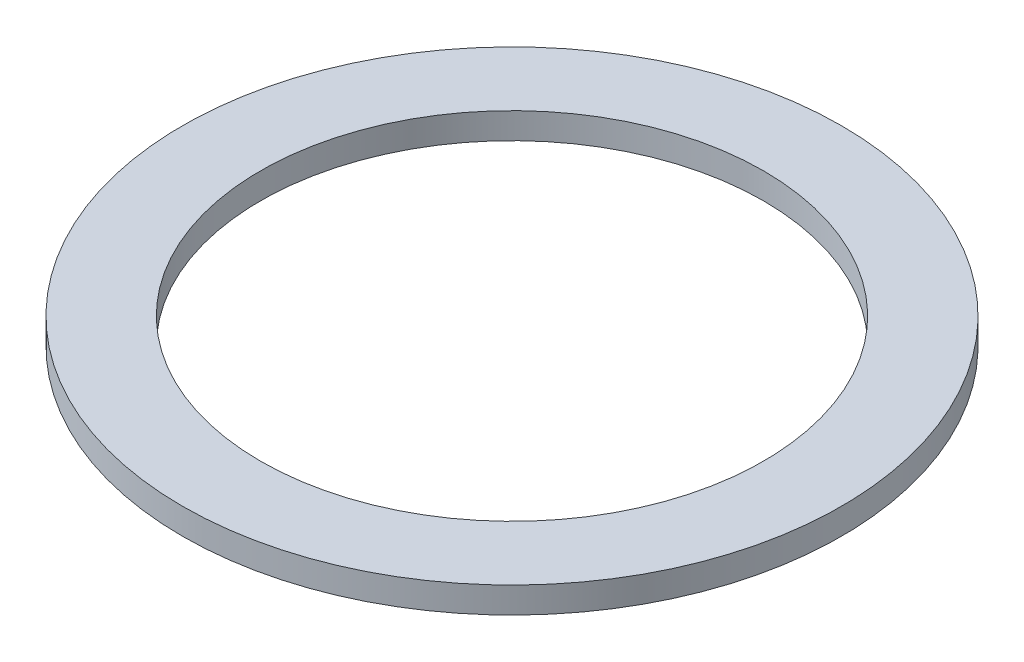
ISO-10303-21;
HEADER;
FILE_DESCRIPTION(('STEP AP214'),'2;1');
FILE_NAME('part.step','',(''),(''),'','','');
FILE_SCHEMA(('AUTOMOTIVE_DESIGN { 1 0 10303 214 1 1 1 1 }'));
ENDSEC;
DATA;
#1=APPLICATION_CONTEXT('core data for automotive mechanical design processes');
#2=APPLICATION_PROTOCOL_DEFINITION('international standard','automotive_design',2000,#1);
#3=PRODUCT_CONTEXT('',#1,'mechanical');
#4=PRODUCT('Part','Part','',(#3));
#5=PRODUCT_RELATED_PRODUCT_CATEGORY('part','',(#4));
#6=PRODUCT_DEFINITION_FORMATION('','',#4);
#7=PRODUCT_DEFINITION_CONTEXT('part definition',#1,'design');
#8=PRODUCT_DEFINITION('design','',#6,#7);
#9=PRODUCT_DEFINITION_SHAPE('','',#8);
#10=(LENGTH_UNIT() NAMED_UNIT(*) SI_UNIT(.MILLI.,.METRE.));
#11=(NAMED_UNIT(*) PLANE_ANGLE_UNIT() SI_UNIT($,.RADIAN.));
#12=(NAMED_UNIT(*) SI_UNIT($,.STERADIAN.) SOLID_ANGLE_UNIT());
#13=UNCERTAINTY_MEASURE_WITH_UNIT(LENGTH_MEASURE(1.E-05),#10,'distance_accuracy_value','');
#14=(GEOMETRIC_REPRESENTATION_CONTEXT(3) GLOBAL_UNCERTAINTY_ASSIGNED_CONTEXT((#13)) GLOBAL_UNIT_ASSIGNED_CONTEXT((#10,
#11,#12)) REPRESENTATION_CONTEXT('',''));
#15=CARTESIAN_POINT('',(0.,0.,0.));
#16=DIRECTION('',(0.,0.,1.));
#17=DIRECTION('',(1.,0.,0.));
#18=AXIS2_PLACEMENT_3D('',#15,#16,#17);
#19=CARTESIAN_POINT('',(0.,3.,0.));
#20=DIRECTION('',(0.,1.,0.));
#21=DIRECTION('',(0.,0.,1.));
#22=AXIS2_PLACEMENT_3D('',#19,#20,#21);
#23=PLANE('',#22);
#24=CARTESIAN_POINT('',(0.,3.,0.));
#25=DIRECTION('',(0.,1.,0.));
#26=DIRECTION('',(0.,0.,1.));
#27=AXIS2_PLACEMENT_3D('',#24,#25,#26);
#28=CIRCLE('',#27,38.);
#29=CARTESIAN_POINT('',(0.,3.,38.));
#30=VERTEX_POINT('',#29);
#31=EDGE_CURVE('E10',#30,#30,#28,.T.);
#32=ORIENTED_EDGE('',*,*,#31,.T.);
#33=EDGE_LOOP('',(#32));
#34=FACE_BOUND('',#33,.T.);
#35=CARTESIAN_POINT('',(0.,3.,0.));
#36=DIRECTION('',(0.,1.,0.));
#37=DIRECTION('',(0.,0.,1.));
#38=AXIS2_PLACEMENT_3D('',#35,#36,#37);
#39=CIRCLE('',#38,29.);
#40=CARTESIAN_POINT('',(0.,3.,29.));
#41=VERTEX_POINT('',#40);
#42=EDGE_CURVE('E46',#41,#41,#39,.T.);
#43=ORIENTED_EDGE('',*,*,#42,.F.);
#44=EDGE_LOOP('',(#43));
#45=FACE_BOUND('',#44,.T.);
#46=ADVANCED_FACE('F35',(#34,#45),#23,.T.);
#47=CARTESIAN_POINT('',(0.,0.,0.));
#48=DIRECTION('',(0.,1.,0.));
#49=DIRECTION('',(0.,0.,1.));
#50=AXIS2_PLACEMENT_3D('',#47,#48,#49);
#51=PLANE('',#50);
#52=CARTESIAN_POINT('',(0.,0.,0.));
#53=DIRECTION('',(0.,1.,0.));
#54=DIRECTION('',(0.,0.,1.));
#55=AXIS2_PLACEMENT_3D('',#52,#53,#54);
#56=CIRCLE('',#55,38.);
#57=CARTESIAN_POINT('',(0.,0.,38.));
#58=VERTEX_POINT('',#57);
#59=EDGE_CURVE('E39',#58,#58,#56,.T.);
#60=ORIENTED_EDGE('',*,*,#59,.F.);
#61=EDGE_LOOP('',(#60));
#62=FACE_BOUND('',#61,.T.);
#63=CARTESIAN_POINT('',(0.,0.,0.));
#64=DIRECTION('',(0.,1.,0.));
#65=DIRECTION('',(0.,0.,1.));
#66=AXIS2_PLACEMENT_3D('',#63,#64,#65);
#67=CIRCLE('',#66,29.);
#68=CARTESIAN_POINT('',(0.,0.,29.));
#69=VERTEX_POINT('',#68);
#70=EDGE_CURVE('E48',#69,#69,#67,.T.);
#71=ORIENTED_EDGE('',*,*,#70,.T.);
#72=EDGE_LOOP('',(#71));
#73=FACE_BOUND('',#72,.T.);
#74=ADVANCED_FACE('F58',(#62,#73),#51,.F.);
#75=CARTESIAN_POINT('',(0.,3.,0.));
#76=DIRECTION('',(0.,-1.,0.));
#77=DIRECTION('',(0.,0.,-1.));
#78=AXIS2_PLACEMENT_3D('',#75,#76,#77);
#79=CYLINDRICAL_SURFACE('',#78,38.);
#80=ORIENTED_EDGE('',*,*,#31,.F.);
#81=EDGE_LOOP('',(#80));
#82=FACE_BOUND('',#81,.T.);
#83=ORIENTED_EDGE('',*,*,#59,.T.);
#84=EDGE_LOOP('',(#83));
#85=FACE_BOUND('',#84,.T.);
#86=ADVANCED_FACE('F37',(#82,#85),#79,.T.);
#87=CARTESIAN_POINT('',(0.,3.,0.));
#88=DIRECTION('',(0.,-1.,0.));
#89=DIRECTION('',(0.,0.,-1.));
#90=AXIS2_PLACEMENT_3D('',#87,#88,#89);
#91=CYLINDRICAL_SURFACE('',#90,29.);
#92=ORIENTED_EDGE('',*,*,#42,.T.);
#93=EDGE_LOOP('',(#92));
#94=FACE_BOUND('',#93,.T.);
#95=ORIENTED_EDGE('',*,*,#70,.F.);
#96=EDGE_LOOP('',(#95));
#97=FACE_BOUND('',#96,.T.);
#98=ADVANCED_FACE('F54',(#94,#97),#91,.F.);
#99=CLOSED_SHELL('',(#46,#74,#86,#98));
#100=MANIFOLD_SOLID_BREP('B2',#99);
#101=ADVANCED_BREP_SHAPE_REPRESENTATION('',(#18,#100),#14);
#102=SHAPE_DEFINITION_REPRESENTATION(#9,#101);
ENDSEC;
END-ISO-10303-21;
